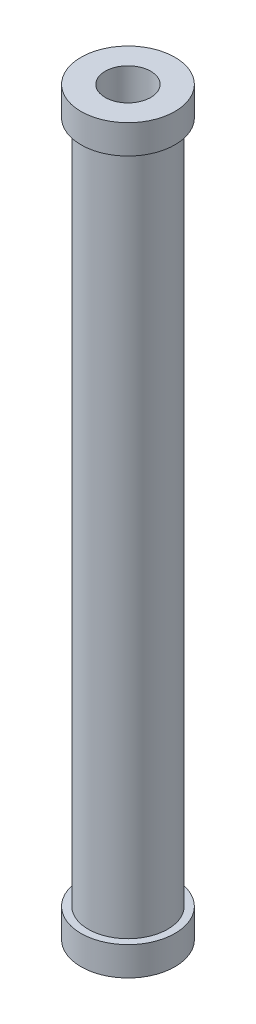
ISO-10303-21;
HEADER;
FILE_DESCRIPTION(('STEP AP214'),'2;1');
FILE_NAME('part.step','',(''),(''),'','','');
FILE_SCHEMA(('AUTOMOTIVE_DESIGN { 1 0 10303 214 1 1 1 1 }'));
ENDSEC;
DATA;
#1=APPLICATION_CONTEXT('core data for automotive mechanical design processes');
#2=APPLICATION_PROTOCOL_DEFINITION('international standard','automotive_design',2000,#1);
#3=PRODUCT_CONTEXT('',#1,'mechanical');
#4=PRODUCT('Part','Part','',(#3));
#5=PRODUCT_RELATED_PRODUCT_CATEGORY('part','',(#4));
#6=PRODUCT_DEFINITION_FORMATION('','',#4);
#7=PRODUCT_DEFINITION_CONTEXT('part definition',#1,'design');
#8=PRODUCT_DEFINITION('design','',#6,#7);
#9=PRODUCT_DEFINITION_SHAPE('','',#8);
#10=(LENGTH_UNIT() NAMED_UNIT(*) SI_UNIT(.MILLI.,.METRE.));
#11=(NAMED_UNIT(*) PLANE_ANGLE_UNIT() SI_UNIT($,.RADIAN.));
#12=(NAMED_UNIT(*) SI_UNIT($,.STERADIAN.) SOLID_ANGLE_UNIT());
#13=UNCERTAINTY_MEASURE_WITH_UNIT(LENGTH_MEASURE(1.E-05),#10,'distance_accuracy_value','');
#14=(GEOMETRIC_REPRESENTATION_CONTEXT(3) GLOBAL_UNCERTAINTY_ASSIGNED_CONTEXT((#13)) GLOBAL_UNIT_ASSIGNED_CONTEXT((#10,
#11,#12)) REPRESENTATION_CONTEXT('',''));
#15=CARTESIAN_POINT('',(0.,0.,0.));
#16=DIRECTION('',(0.,0.,1.));
#17=DIRECTION('',(1.,0.,0.));
#18=AXIS2_PLACEMENT_3D('',#15,#16,#17);
#19=CARTESIAN_POINT('',(0.,51.25,0.));
#20=DIRECTION('',(0.,-1.,0.));
#21=DIRECTION('',(0.,0.,-1.));
#22=AXIS2_PLACEMENT_3D('',#19,#20,#21);
#23=CYLINDRICAL_SURFACE('',#22,2.75);
#24=CARTESIAN_POINT('',(0.,2.,0.));
#25=DIRECTION('',(0.,1.,0.));
#26=DIRECTION('',(0.,0.,1.));
#27=AXIS2_PLACEMENT_3D('',#24,#25,#26);
#28=CIRCLE('',#27,2.75);
#29=CARTESIAN_POINT('',(0.,2.,-2.75));
#30=VERTEX_POINT('',#29);
#31=EDGE_CURVE('E64',#30,#30,#28,.T.);
#32=CARTESIAN_POINT('',(0.,49.25,0.));
#33=DIRECTION('',(0.,1.,0.));
#34=DIRECTION('',(0.,0.,1.));
#35=AXIS2_PLACEMENT_3D('',#32,#33,#34);
#36=CIRCLE('',#35,2.75);
#37=CARTESIAN_POINT('',(0.,49.25,-2.75));
#38=VERTEX_POINT('',#37);
#39=EDGE_CURVE('E10',#38,#38,#36,.T.);
#40=CARTESIAN_POINT('',(0.,2.,-2.75));
#41=CARTESIAN_POINT('',(0.,2.4921875,-2.75));
#42=CARTESIAN_POINT('',(0.,2.984375,-2.75));
#43=CARTESIAN_POINT('',(0.,3.96875,-2.75));
#44=CARTESIAN_POINT('',(0.,4.4609375,-2.75));
#45=CARTESIAN_POINT('',(0.,5.4453125,-2.75));
#46=CARTESIAN_POINT('',(0.,5.9375,-2.75));
#47=CARTESIAN_POINT('',(0.,6.921875,-2.75));
#48=CARTESIAN_POINT('',(0.,7.4140625,-2.75));
#49=CARTESIAN_POINT('',(0.,8.3984375,-2.75));
#50=CARTESIAN_POINT('',(0.,8.890625,-2.75));
#51=CARTESIAN_POINT('',(0.,9.875,-2.75));
#52=CARTESIAN_POINT('',(0.,10.3671875,-2.75));
#53=CARTESIAN_POINT('',(0.,11.3515625,-2.75));
#54=CARTESIAN_POINT('',(0.,11.84375,-2.75));
#55=CARTESIAN_POINT('',(0.,12.828125,-2.75));
#56=CARTESIAN_POINT('',(0.,13.3203125,-2.75));
#57=CARTESIAN_POINT('',(0.,14.3046875,-2.75));
#58=CARTESIAN_POINT('',(0.,14.796875,-2.75));
#59=CARTESIAN_POINT('',(0.,15.78125,-2.75));
#60=CARTESIAN_POINT('',(0.,16.2734375,-2.75));
#61=CARTESIAN_POINT('',(0.,17.2578125,-2.75));
#62=CARTESIAN_POINT('',(0.,17.75,-2.75));
#63=CARTESIAN_POINT('',(0.,18.734375,-2.75));
#64=CARTESIAN_POINT('',(0.,19.2265625,-2.75));
#65=CARTESIAN_POINT('',(0.,20.2109375,-2.75));
#66=CARTESIAN_POINT('',(0.,20.703125,-2.75));
#67=CARTESIAN_POINT('',(0.,21.6875,-2.75));
#68=CARTESIAN_POINT('',(0.,22.1796875,-2.75));
#69=CARTESIAN_POINT('',(0.,23.1640625,-2.75));
#70=CARTESIAN_POINT('',(0.,23.65625,-2.75));
#71=CARTESIAN_POINT('',(0.,24.640625,-2.75));
#72=CARTESIAN_POINT('',(0.,25.1328125,-2.75));
#73=CARTESIAN_POINT('',(0.,26.1171875,-2.75));
#74=CARTESIAN_POINT('',(0.,26.609375,-2.75));
#75=CARTESIAN_POINT('',(0.,27.59375,-2.75));
#76=CARTESIAN_POINT('',(0.,28.0859375,-2.75));
#77=CARTESIAN_POINT('',(0.,29.0703125,-2.75));
#78=CARTESIAN_POINT('',(0.,29.5625,-2.75));
#79=CARTESIAN_POINT('',(0.,30.546875,-2.75));
#80=CARTESIAN_POINT('',(0.,31.0390625,-2.75));
#81=CARTESIAN_POINT('',(0.,32.0234375,-2.75));
#82=CARTESIAN_POINT('',(0.,32.515625,-2.75));
#83=CARTESIAN_POINT('',(0.,33.5,-2.75));
#84=CARTESIAN_POINT('',(0.,33.9921875,-2.75));
#85=CARTESIAN_POINT('',(0.,34.9765625,-2.75));
#86=CARTESIAN_POINT('',(0.,35.46875,-2.75));
#87=CARTESIAN_POINT('',(0.,36.453125,-2.75));
#88=CARTESIAN_POINT('',(0.,36.9453125,-2.75));
#89=CARTESIAN_POINT('',(0.,37.9296875,-2.75));
#90=CARTESIAN_POINT('',(0.,38.421875,-2.75));
#91=CARTESIAN_POINT('',(0.,39.40625,-2.75));
#92=CARTESIAN_POINT('',(0.,39.8984375,-2.75));
#93=CARTESIAN_POINT('',(0.,40.8828125,-2.75));
#94=CARTESIAN_POINT('',(0.,41.375,-2.75));
#95=CARTESIAN_POINT('',(0.,42.359375,-2.75));
#96=CARTESIAN_POINT('',(0.,42.8515625,-2.75));
#97=CARTESIAN_POINT('',(0.,43.8359375,-2.75));
#98=CARTESIAN_POINT('',(0.,44.328125,-2.75));
#99=CARTESIAN_POINT('',(0.,45.3125,-2.75));
#100=CARTESIAN_POINT('',(0.,45.8046875,-2.75));
#101=CARTESIAN_POINT('',(0.,46.7890625,-2.75));
#102=CARTESIAN_POINT('',(0.,47.28125,-2.75));
#103=CARTESIAN_POINT('',(0.,48.265625,-2.75));
#104=CARTESIAN_POINT('',(0.,48.7578125,-2.75));
#105=CARTESIAN_POINT('',(0.,49.25,-2.75));
#106=B_SPLINE_CURVE_WITH_KNOTS('',3,(#40,#41,#42,#43,#44,#45,#46,#47,#48,#49,#50,#51,#52,#53,
#54,#55,#56,#57,#58,#59,#60,#61,#62,#63,#64,#65,#66,#67,#68,#69,#70,#71,#72,#73,#74,#75,#76,#77,
#78,#79,#80,#81,#82,#83,#84,#85,#86,#87,#88,#89,#90,#91,#92,#93,#94,#95,#96,#97,#98,#99,#100,
#101,#102,#103,#104,#105),.UNSPECIFIED.,.F.,.F.,(4,2,2,2,2,2,2,2,2,2,2,2,2,2,2,2,2,2,2,2,2,2,2,
2,2,2,2,2,2,2,2,2,4),(0.,1.4765625,2.953125,4.4296875,5.90625,7.3828125,8.859375,10.3359375,
11.8125,13.2890625,14.765625,16.2421875,17.71875,19.1953125,20.671875,22.1484375,23.625,
25.1015625,26.578125,28.0546875,29.53125,31.0078125,32.484375,33.9609375,35.4375,36.9140625,
38.390625,39.8671875,41.34375,42.8203125,44.296875,45.7734375,47.25),.UNSPECIFIED.);
#107=EDGE_CURVE('BSEAM39',#30,#38,#106,.T.);
#108=ORIENTED_EDGE('',*,*,#31,.T.);
#109=ORIENTED_EDGE('',*,*,#39,.F.);
#110=ORIENTED_EDGE('',*,*,#107,.T.);
#111=ORIENTED_EDGE('',*,*,#107,.F.);
#112=EDGE_LOOP('',(#108,#110,#109,#111));
#113=FACE_BOUND('',#112,.T.);
#114=ADVANCED_FACE('F39',(#113),#23,.T.);
#115=CARTESIAN_POINT('',(0.,51.25,0.));
#116=DIRECTION('',(0.,-1.,0.));
#117=DIRECTION('',(0.,0.,-1.));
#118=AXIS2_PLACEMENT_3D('',#115,#116,#117);
#119=CYLINDRICAL_SURFACE('',#118,1.575);
#120=CARTESIAN_POINT('',(0.,51.25,0.));
#121=DIRECTION('',(0.,1.,0.));
#122=DIRECTION('',(0.,0.,1.));
#123=AXIS2_PLACEMENT_3D('',#120,#121,#122);
#124=CIRCLE('',#123,1.575);
#125=CARTESIAN_POINT('',(0.,51.25,-1.575));
#126=VERTEX_POINT('',#125);
#127=EDGE_CURVE('E47',#126,#126,#124,.T.);
#128=CARTESIAN_POINT('',(0.,0.,0.));
#129=DIRECTION('',(0.,1.,0.));
#130=DIRECTION('',(0.,0.,1.));
#131=AXIS2_PLACEMENT_3D('',#128,#129,#130);
#132=CIRCLE('',#131,1.575);
#133=CARTESIAN_POINT('',(0.,0.,-1.575));
#134=VERTEX_POINT('',#133);
#135=EDGE_CURVE('E52',#134,#134,#132,.T.);
#136=CARTESIAN_POINT('',(0.,51.25,-1.575));
#137=CARTESIAN_POINT('',(0.,50.7161458333333,-1.575));
#138=CARTESIAN_POINT('',(0.,50.1822916666667,-1.575));
#139=CARTESIAN_POINT('',(0.,49.1145833333333,-1.575));
#140=CARTESIAN_POINT('',(0.,48.5807291666667,-1.575));
#141=CARTESIAN_POINT('',(0.,47.5130208333333,-1.575));
#142=CARTESIAN_POINT('',(0.,46.9791666666667,-1.575));
#143=CARTESIAN_POINT('',(0.,45.9114583333333,-1.575));
#144=CARTESIAN_POINT('',(0.,45.3776041666667,-1.575));
#145=CARTESIAN_POINT('',(0.,44.3098958333333,-1.575));
#146=CARTESIAN_POINT('',(0.,43.7760416666667,-1.575));
#147=CARTESIAN_POINT('',(0.,42.7083333333333,-1.575));
#148=CARTESIAN_POINT('',(0.,42.1744791666667,-1.575));
#149=CARTESIAN_POINT('',(0.,41.1067708333333,-1.575));
#150=CARTESIAN_POINT('',(0.,40.5729166666667,-1.575));
#151=CARTESIAN_POINT('',(0.,39.5052083333333,-1.575));
#152=CARTESIAN_POINT('',(0.,38.9713541666667,-1.575));
#153=CARTESIAN_POINT('',(0.,37.9036458333333,-1.575));
#154=CARTESIAN_POINT('',(0.,37.3697916666667,-1.575));
#155=CARTESIAN_POINT('',(0.,36.3020833333333,-1.575));
#156=CARTESIAN_POINT('',(0.,35.7682291666667,-1.575));
#157=CARTESIAN_POINT('',(0.,34.7005208333333,-1.575));
#158=CARTESIAN_POINT('',(0.,34.1666666666667,-1.575));
#159=CARTESIAN_POINT('',(0.,33.0989583333333,-1.575));
#160=CARTESIAN_POINT('',(0.,32.5651041666667,-1.575));
#161=CARTESIAN_POINT('',(0.,31.4973958333333,-1.575));
#162=CARTESIAN_POINT('',(0.,30.9635416666667,-1.575));
#163=CARTESIAN_POINT('',(0.,29.8958333333333,-1.575));
#164=CARTESIAN_POINT('',(0.,29.3619791666667,-1.575));
#165=CARTESIAN_POINT('',(0.,28.2942708333333,-1.575));
#166=CARTESIAN_POINT('',(0.,27.7604166666667,-1.575));
#167=CARTESIAN_POINT('',(0.,26.6927083333333,-1.575));
#168=CARTESIAN_POINT('',(0.,26.1588541666667,-1.575));
#169=CARTESIAN_POINT('',(0.,25.0911458333333,-1.575));
#170=CARTESIAN_POINT('',(0.,24.5572916666667,-1.575));
#171=CARTESIAN_POINT('',(0.,23.4895833333333,-1.575));
#172=CARTESIAN_POINT('',(0.,22.9557291666667,-1.575));
#173=CARTESIAN_POINT('',(0.,21.8880208333333,-1.575));
#174=CARTESIAN_POINT('',(0.,21.3541666666667,-1.575));
#175=CARTESIAN_POINT('',(0.,20.2864583333333,-1.575));
#176=CARTESIAN_POINT('',(0.,19.7526041666667,-1.575));
#177=CARTESIAN_POINT('',(0.,18.6848958333333,-1.575));
#178=CARTESIAN_POINT('',(0.,18.1510416666667,-1.575));
#179=CARTESIAN_POINT('',(0.,17.0833333333333,-1.575));
#180=CARTESIAN_POINT('',(0.,16.5494791666667,-1.575));
#181=CARTESIAN_POINT('',(0.,15.4817708333333,-1.575));
#182=CARTESIAN_POINT('',(0.,14.9479166666667,-1.575));
#183=CARTESIAN_POINT('',(0.,13.8802083333333,-1.575));
#184=CARTESIAN_POINT('',(0.,13.3463541666667,-1.575));
#185=CARTESIAN_POINT('',(0.,12.2786458333333,-1.575));
#186=CARTESIAN_POINT('',(0.,11.7447916666667,-1.575));
#187=CARTESIAN_POINT('',(0.,10.6770833333333,-1.575));
#188=CARTESIAN_POINT('',(0.,10.1432291666667,-1.575));
#189=CARTESIAN_POINT('',(0.,9.07552083333334,-1.575));
#190=CARTESIAN_POINT('',(0.,8.54166666666667,-1.575));
#191=CARTESIAN_POINT('',(0.,7.47395833333334,-1.575));
#192=CARTESIAN_POINT('',(0.,6.94010416666667,-1.575));
#193=CARTESIAN_POINT('',(0.,5.87239583333334,-1.575));
#194=CARTESIAN_POINT('',(0.,5.33854166666667,-1.575));
#195=CARTESIAN_POINT('',(0.,4.27083333333333,-1.575));
#196=CARTESIAN_POINT('',(0.,3.73697916666667,-1.575));
#197=CARTESIAN_POINT('',(0.,2.66927083333333,-1.575));
#198=CARTESIAN_POINT('',(0.,2.13541666666667,-1.575));
#199=CARTESIAN_POINT('',(0.,1.06770833333333,-1.575));
#200=CARTESIAN_POINT('',(0.,0.533854166666667,-1.575));
#201=CARTESIAN_POINT('',(0.,0.,-1.575));
#202=B_SPLINE_CURVE_WITH_KNOTS('',3,(#136,#137,#138,#139,#140,#141,#142,#143,#144,#145,#146,
#147,#148,#149,#150,#151,#152,#153,#154,#155,#156,#157,#158,#159,#160,#161,#162,#163,#164,#165,
#166,#167,#168,#169,#170,#171,#172,#173,#174,#175,#176,#177,#178,#179,#180,#181,#182,#183,#184,
#185,#186,#187,#188,#189,#190,#191,#192,#193,#194,#195,#196,#197,#198,#199,#200,#201),
.UNSPECIFIED.,.F.,.F.,(4,2,2,2,2,2,2,2,2,2,2,2,2,2,2,2,2,2,2,2,2,2,2,2,2,2,2,2,2,2,2,2,4),(0.,
1.6015625,3.203125,4.8046875,6.40625,8.0078125,9.609375,11.2109375,12.8125,14.4140625,16.015625,
17.6171875,19.21875,20.8203125,22.421875,24.0234375,25.625,27.2265625,28.828125,30.4296875,
32.03125,33.6328125,35.234375,36.8359375,38.4375,40.0390625,41.640625,43.2421875,44.84375,
46.4453125,48.046875,49.6484375,51.25),.UNSPECIFIED.);
#203=EDGE_CURVE('BSEAM41',#126,#134,#202,.T.);
#204=ORIENTED_EDGE('',*,*,#127,.T.);
#205=ORIENTED_EDGE('',*,*,#135,.F.);
#206=ORIENTED_EDGE('',*,*,#203,.T.);
#207=ORIENTED_EDGE('',*,*,#203,.F.);
#208=EDGE_LOOP('',(#204,#206,#205,#207));
#209=FACE_BOUND('',#208,.T.);
#210=ADVANCED_FACE('F41',(#209),#119,.F.);
#211=CARTESIAN_POINT('',(0.,51.25,0.));
#212=DIRECTION('',(0.,1.,0.));
#213=DIRECTION('',(0.,0.,1.));
#214=AXIS2_PLACEMENT_3D('',#211,#212,#213);
#215=PLANE('',#214);
#216=ORIENTED_EDGE('',*,*,#127,.F.);
#217=EDGE_LOOP('',(#216));
#218=FACE_BOUND('',#217,.T.);
#219=CARTESIAN_POINT('',(0.,51.25,0.));
#220=DIRECTION('',(0.,1.,0.));
#221=DIRECTION('',(0.,0.,1.));
#222=AXIS2_PLACEMENT_3D('',#219,#220,#221);
#223=CIRCLE('',#222,3.25);
#224=CARTESIAN_POINT('',(0.,51.25,3.25));
#225=VERTEX_POINT('',#224);
#226=EDGE_CURVE('E65',#225,#225,#223,.T.);
#227=ORIENTED_EDGE('',*,*,#226,.T.);
#228=EDGE_LOOP('',(#227));
#229=FACE_BOUND('',#228,.T.);
#230=ADVANCED_FACE('F80',(#218,#229),#215,.T.);
#231=CARTESIAN_POINT('',(0.,0.,0.));
#232=DIRECTION('',(0.,1.,0.));
#233=DIRECTION('',(0.,0.,1.));
#234=AXIS2_PLACEMENT_3D('',#231,#232,#233);
#235=PLANE('',#234);
#236=ORIENTED_EDGE('',*,*,#135,.T.);
#237=EDGE_LOOP('',(#236));
#238=FACE_BOUND('',#237,.T.);
#239=CARTESIAN_POINT('',(0.,0.,0.));
#240=DIRECTION('',(0.,1.,0.));
#241=DIRECTION('',(0.,0.,1.));
#242=AXIS2_PLACEMENT_3D('',#239,#240,#241);
#243=CIRCLE('',#242,3.25);
#244=CARTESIAN_POINT('',(0.,0.,3.25));
#245=VERTEX_POINT('',#244);
#246=EDGE_CURVE('E60',#245,#245,#243,.T.);
#247=ORIENTED_EDGE('',*,*,#246,.F.);
#248=EDGE_LOOP('',(#247));
#249=FACE_BOUND('',#248,.T.);
#250=ADVANCED_FACE('F101',(#238,#249),#235,.F.);
#251=CARTESIAN_POINT('',(0.,2.,0.));
#252=DIRECTION('',(0.,-1.,0.));
#253=DIRECTION('',(0.,0.,-1.));
#254=AXIS2_PLACEMENT_3D('',#251,#252,#253);
#255=CYLINDRICAL_SURFACE('',#254,3.25);
#256=CARTESIAN_POINT('',(0.,2.,0.));
#257=DIRECTION('',(0.,1.,0.));
#258=DIRECTION('',(0.,0.,1.));
#259=AXIS2_PLACEMENT_3D('',#256,#257,#258);
#260=CIRCLE('',#259,3.25);
#261=CARTESIAN_POINT('',(0.,2.,3.25));
#262=VERTEX_POINT('',#261);
#263=EDGE_CURVE('E58',#262,#262,#260,.T.);
#264=ORIENTED_EDGE('',*,*,#263,.F.);
#265=EDGE_LOOP('',(#264));
#266=FACE_BOUND('',#265,.T.);
#267=ORIENTED_EDGE('',*,*,#246,.T.);
#268=EDGE_LOOP('',(#267));
#269=FACE_BOUND('',#268,.T.);
#270=ADVANCED_FACE('F104',(#266,#269),#255,.T.);
#271=CARTESIAN_POINT('',(0.,2.,0.));
#272=DIRECTION('',(0.,1.,0.));
#273=DIRECTION('',(0.,0.,1.));
#274=AXIS2_PLACEMENT_3D('',#271,#272,#273);
#275=PLANE('',#274);
#276=ORIENTED_EDGE('',*,*,#31,.F.);
#277=EDGE_LOOP('',(#276));
#278=FACE_BOUND('',#277,.T.);
#279=ORIENTED_EDGE('',*,*,#263,.T.);
#280=EDGE_LOOP('',(#279));
#281=FACE_BOUND('',#280,.T.);
#282=ADVANCED_FACE('F86',(#278,#281),#275,.T.);
#283=CARTESIAN_POINT('',(0.,51.25,0.));
#284=DIRECTION('',(0.,-1.,0.));
#285=DIRECTION('',(0.,0.,-1.));
#286=AXIS2_PLACEMENT_3D('',#283,#284,#285);
#287=CYLINDRICAL_SURFACE('',#286,3.25);
#288=ORIENTED_EDGE('',*,*,#226,.F.);
#289=EDGE_LOOP('',(#288));
#290=FACE_BOUND('',#289,.T.);
#291=CARTESIAN_POINT('',(0.,49.25,0.));
#292=DIRECTION('',(0.,1.,0.));
#293=DIRECTION('',(0.,0.,1.));
#294=AXIS2_PLACEMENT_3D('',#291,#292,#293);
#295=CIRCLE('',#294,3.25);
#296=CARTESIAN_POINT('',(0.,49.25,3.25));
#297=VERTEX_POINT('',#296);
#298=EDGE_CURVE('E72',#297,#297,#295,.T.);
#299=ORIENTED_EDGE('',*,*,#298,.T.);
#300=EDGE_LOOP('',(#299));
#301=FACE_BOUND('',#300,.T.);
#302=ADVANCED_FACE('F82',(#290,#301),#287,.T.);
#303=CARTESIAN_POINT('',(0.,49.25,0.));
#304=DIRECTION('',(0.,1.,0.));
#305=DIRECTION('',(0.,0.,1.));
#306=AXIS2_PLACEMENT_3D('',#303,#304,#305);
#307=PLANE('',#306);
#308=ORIENTED_EDGE('',*,*,#39,.T.);
#309=EDGE_LOOP('',(#308));
#310=FACE_BOUND('',#309,.T.);
#311=ORIENTED_EDGE('',*,*,#298,.F.);
#312=EDGE_LOOP('',(#311));
#313=FACE_BOUND('',#312,.T.);
#314=ADVANCED_FACE('F85',(#310,#313),#307,.F.);
#315=CLOSED_SHELL('',(#114,#210,#230,#250,#270,#282,#302,#314));
#316=MANIFOLD_SOLID_BREP('B2',#315);
#317=ADVANCED_BREP_SHAPE_REPRESENTATION('',(#18,#316),#14);
#318=SHAPE_DEFINITION_REPRESENTATION(#9,#317);
ENDSEC;
END-ISO-10303-21;
